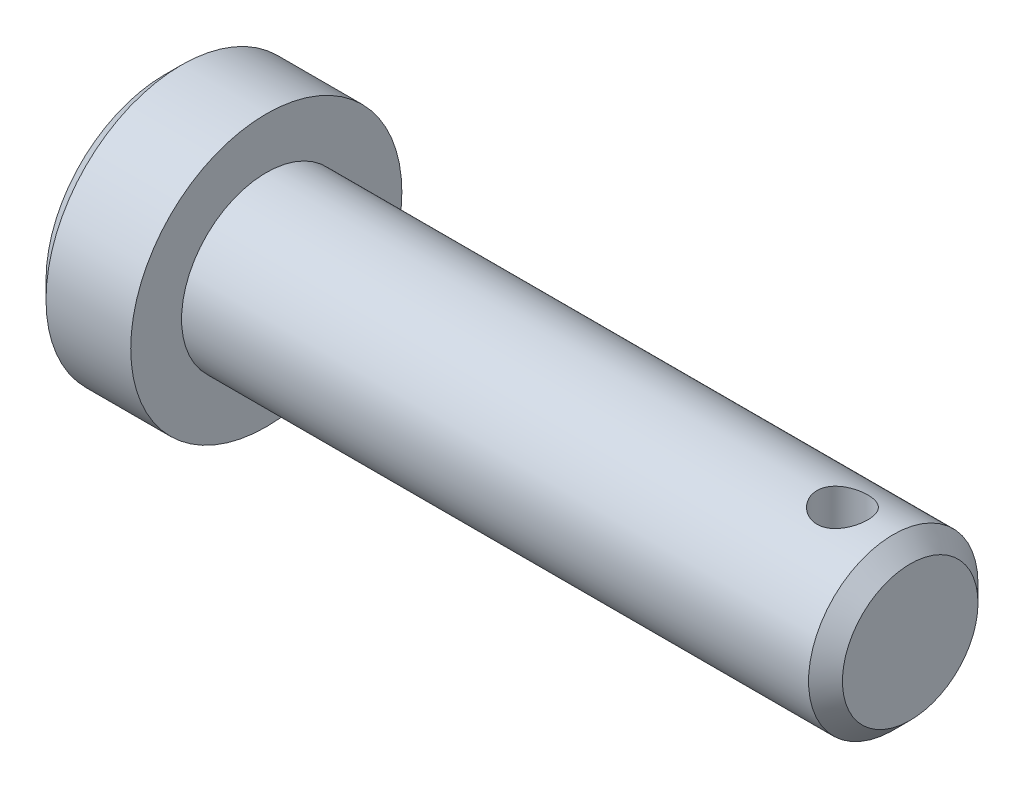
ISO-10303-21;
HEADER;
FILE_DESCRIPTION(('STEP AP214'),'2;1');
FILE_NAME('part.step','',(''),(''),'','','');
FILE_SCHEMA(('AUTOMOTIVE_DESIGN { 1 0 10303 214 1 1 1 1 }'));
ENDSEC;
DATA;
#1=APPLICATION_CONTEXT('core data for automotive mechanical design processes');
#2=APPLICATION_PROTOCOL_DEFINITION('international standard','automotive_design',2000,#1);
#3=PRODUCT_CONTEXT('',#1,'mechanical');
#4=PRODUCT('Part','Part','',(#3));
#5=PRODUCT_RELATED_PRODUCT_CATEGORY('part','',(#4));
#6=PRODUCT_DEFINITION_FORMATION('','',#4);
#7=PRODUCT_DEFINITION_CONTEXT('part definition',#1,'design');
#8=PRODUCT_DEFINITION('design','',#6,#7);
#9=PRODUCT_DEFINITION_SHAPE('','',#8);
#10=(LENGTH_UNIT() NAMED_UNIT(*) SI_UNIT(.MILLI.,.METRE.));
#11=(NAMED_UNIT(*) PLANE_ANGLE_UNIT() SI_UNIT($,.RADIAN.));
#12=(NAMED_UNIT(*) SI_UNIT($,.STERADIAN.) SOLID_ANGLE_UNIT());
#13=UNCERTAINTY_MEASURE_WITH_UNIT(LENGTH_MEASURE(1.E-05),#10,'distance_accuracy_value','');
#14=(GEOMETRIC_REPRESENTATION_CONTEXT(3) GLOBAL_UNCERTAINTY_ASSIGNED_CONTEXT((#13)) GLOBAL_UNIT_ASSIGNED_CONTEXT((#10,
#11,#12)) REPRESENTATION_CONTEXT('',''));
#15=CARTESIAN_POINT('',(0.,0.,0.));
#16=DIRECTION('',(0.,0.,1.));
#17=DIRECTION('',(1.,0.,0.));
#18=AXIS2_PLACEMENT_3D('',#15,#16,#17);
#19=CARTESIAN_POINT('',(-26.2666666666667,0.,0.));
#20=DIRECTION('',(-1.,0.,0.));
#21=DIRECTION('',(0.,0.,1.));
#22=AXIS2_PLACEMENT_3D('',#19,#20,#21);
#23=PLANE('',#22);
#24=CARTESIAN_POINT('',(-26.2666666666667,0.,0.));
#25=DIRECTION('',(-1.,0.,0.));
#26=DIRECTION('',(0.,0.,1.));
#27=AXIS2_PLACEMENT_3D('',#24,#25,#26);
#28=CIRCLE('',#27,6.99999999999999);
#29=CARTESIAN_POINT('',(-26.2666666666667,0.,6.99999999999999));
#30=VERTEX_POINT('',#29);
#31=EDGE_CURVE('E10',#30,#30,#28,.T.);
#32=ORIENTED_EDGE('',*,*,#31,.T.);
#33=EDGE_LOOP('',(#32));
#34=FACE_BOUND('',#33,.T.);
#35=ADVANCED_FACE('F36',(#34),#23,.T.);
#36=CARTESIAN_POINT('',(0.,0.,0.));
#37=DIRECTION('',(1.,0.,0.));
#38=DIRECTION('',(0.,0.,-1.));
#39=AXIS2_PLACEMENT_3D('',#36,#37,#38);
#40=CYLINDRICAL_SURFACE('',#39,8.);
#41=CARTESIAN_POINT('',(-25.2666666666667,0.,0.));
#42=DIRECTION('',(-1.,0.,0.));
#43=DIRECTION('',(0.,0.,1.));
#44=AXIS2_PLACEMENT_3D('',#41,#42,#43);
#45=CIRCLE('',#44,8.);
#46=CARTESIAN_POINT('',(-25.2666666666667,0.,8.));
#47=VERTEX_POINT('',#46);
#48=EDGE_CURVE('E49',#47,#47,#45,.F.);
#49=ORIENTED_EDGE('',*,*,#48,.T.);
#50=EDGE_LOOP('',(#49));
#51=FACE_BOUND('',#50,.T.);
#52=CARTESIAN_POINT('',(-20.2666666666667,0.,0.));
#53=DIRECTION('',(1.,0.,0.));
#54=DIRECTION('',(0.,0.,-1.));
#55=AXIS2_PLACEMENT_3D('',#52,#53,#54);
#56=CIRCLE('',#55,8.);
#57=CARTESIAN_POINT('',(-20.2666666666667,0.,-8.));
#58=VERTEX_POINT('',#57);
#59=EDGE_CURVE('E98',#58,#58,#56,.T.);
#60=ORIENTED_EDGE('',*,*,#59,.F.);
#61=EDGE_LOOP('',(#60));
#62=FACE_BOUND('',#61,.T.);
#63=ADVANCED_FACE('F84',(#51,#62),#40,.T.);
#64=CARTESIAN_POINT('',(-20.2666666666667,8.,0.));
#65=DIRECTION('',(1.,0.,0.));
#66=DIRECTION('',(0.,0.,-1.));
#67=AXIS2_PLACEMENT_3D('',#64,#65,#66);
#68=PLANE('',#67);
#69=ORIENTED_EDGE('',*,*,#59,.T.);
#70=EDGE_LOOP('',(#69));
#71=FACE_BOUND('',#70,.T.);
#72=CARTESIAN_POINT('',(-20.2666666666667,0.,0.));
#73=DIRECTION('',(1.,0.,0.));
#74=DIRECTION('',(0.,0.,-1.));
#75=AXIS2_PLACEMENT_3D('',#72,#73,#74);
#76=CIRCLE('',#75,5.);
#77=CARTESIAN_POINT('',(-20.2666666666667,0.,-5.));
#78=VERTEX_POINT('',#77);
#79=EDGE_CURVE('E101',#78,#78,#76,.T.);
#80=ORIENTED_EDGE('',*,*,#79,.F.);
#81=EDGE_LOOP('',(#80));
#82=FACE_BOUND('',#81,.T.);
#83=ADVANCED_FACE('F80',(#71,#82),#68,.T.);
#84=CARTESIAN_POINT('',(0.,0.,0.));
#85=DIRECTION('',(1.,0.,0.));
#86=DIRECTION('',(0.,0.,-1.));
#87=AXIS2_PLACEMENT_3D('',#84,#85,#86);
#88=CYLINDRICAL_SURFACE('',#87,5.);
#89=CARTESIAN_POINT('',(13.7333333333333,-4.76969600708473,1.5));
#90=CARTESIAN_POINT('',(13.6511387853909,-4.7696968572698,1.49999897633764));
#91=CARTESIAN_POINT('',(13.5689341091893,-4.77184390209068,1.49322108167142));
#92=CARTESIAN_POINT('',(13.4069280837414,-4.780165783029,1.46635844446749));
#93=CARTESIAN_POINT('',(13.3271275468318,-4.78634196493468,1.44626925573578));
#94=CARTESIAN_POINT('',(13.1722986050616,-4.80196102485632,1.39352753269955));
#95=CARTESIAN_POINT('',(13.0972625037002,-4.81139846703232,1.36089589394243));
#96=CARTESIAN_POINT('',(12.953711399338,-4.83246932547567,1.28406421917929));
#97=CARTESIAN_POINT('',(12.8851973746489,-4.84410307041019,1.23986245137053));
#98=CARTESIAN_POINT('',(12.7544669427559,-4.86866862185765,1.13964754141627));
#99=CARTESIAN_POINT('',(12.692487435387,-4.88162808311635,1.08333207175807));
#100=CARTESIAN_POINT('',(12.5786953820108,-4.90714861936757,0.961136237579597));
#101=CARTESIAN_POINT('',(12.5268841428834,-4.91970964297705,0.89525464546111));
#102=CARTESIAN_POINT('',(12.4338706335,-4.94333214579389,0.754111437793689));
#103=CARTESIAN_POINT('',(12.3929099088905,-4.95435724342404,0.678684021335814));
#104=CARTESIAN_POINT('',(12.3243460742905,-4.97334435920684,0.521624645369353));
#105=CARTESIAN_POINT('',(12.2967400834758,-4.98130703789495,0.439994028387911));
#106=CARTESIAN_POINT('',(12.2564533322428,-4.99307646003589,0.275323852630829));
#107=CARTESIAN_POINT('',(12.2433682056806,-4.99699557369338,0.1923913989538));
#108=CARTESIAN_POINT('',(12.2312160086869,-5.00063201501347,0.025421823749314));
#109=CARTESIAN_POINT('',(12.2321459939313,-5.00035022521079,-0.0586150620503692));
#110=CARTESIAN_POINT('',(12.2477262018763,-4.99569603817658,-0.222571156600161));
#111=CARTESIAN_POINT('',(12.2619385271432,-4.9914542020526,-0.302536267641342));
#112=CARTESIAN_POINT('',(12.3029646693276,-4.97951522112593,-0.458889213442528));
#113=CARTESIAN_POINT('',(12.329779284276,-4.97181785750586,-0.535276821322847));
#114=CARTESIAN_POINT('',(12.3955453567519,-4.95365220986963,-0.683347326351282));
#115=CARTESIAN_POINT('',(12.4346345361406,-4.94315269676706,-0.754965064694479));
#116=CARTESIAN_POINT('',(12.5237311857615,-4.92049640648069,-0.890764673783157));
#117=CARTESIAN_POINT('',(12.5737412462968,-4.90833923637778,-0.954944774872132));
#118=CARTESIAN_POINT('',(12.6855310840849,-4.88311550488165,-1.0766604815298));
#119=CARTESIAN_POINT('',(12.747690252363,-4.87003195321461,-1.13384458040112));
#120=CARTESIAN_POINT('',(12.8808433512233,-4.84483979887497,-1.23707651539824));
#121=CARTESIAN_POINT('',(12.9518381587225,-4.8327312931702,-1.28312324482853));
#122=CARTESIAN_POINT('',(13.1015728025823,-4.81077903197677,-1.3631399533545));
#123=CARTESIAN_POINT('',(13.1803803791962,-4.80095810695956,-1.3969898923768));
#124=CARTESIAN_POINT('',(13.3429405417788,-4.78496392548436,-1.45083362878413));
#125=CARTESIAN_POINT('',(13.4266915048679,-4.77878947915829,-1.4708319464056));
#126=CARTESIAN_POINT('',(13.5934156940726,-4.77104849541241,-1.49574770282165));
#127=CARTESIAN_POINT('',(13.6763015572273,-4.7693187867044,-1.50119946380212));
#128=CARTESIAN_POINT('',(13.8418062333432,-4.77021192441924,-1.49835947233062));
#129=CARTESIAN_POINT('',(13.9244250820641,-4.77283416156589,-1.4900696437133));
#130=CARTESIAN_POINT('',(14.0848217113042,-4.78197558554912,-1.4604576357419));
#131=CARTESIAN_POINT('',(14.1626694975968,-4.78839176507488,-1.4394796143128));
#132=CARTESIAN_POINT('',(14.3137350241482,-4.80429141231227,-1.3854857774794));
#133=CARTESIAN_POINT('',(14.3869520474739,-4.81377535359073,-1.3524681034276));
#134=CARTESIAN_POINT('',(14.5288507974054,-4.83505835023047,-1.274318711965));
#135=CARTESIAN_POINT('',(14.5973580543191,-4.84691271069798,-1.22888564172729));
#136=CARTESIAN_POINT('',(14.7259714395141,-4.87148205646987,-1.12755301600385));
#137=CARTESIAN_POINT('',(14.7860755509461,-4.88419724730003,-1.07165095534896));
#138=CARTESIAN_POINT('',(14.898513739148,-4.90963633548158,-0.948455132493598));
#139=CARTESIAN_POINT('',(14.9504689623203,-4.92234245063004,-0.880811065857433));
#140=CARTESIAN_POINT('',(15.042300034361,-4.9458485174865,-0.737461784590248));
#141=CARTESIAN_POINT('',(15.0821764831148,-4.95664856384717,-0.661756970543943));
#142=CARTESIAN_POINT('',(15.1483333639016,-4.97505970474957,-0.504935504705221));
#143=CARTESIAN_POINT('',(15.1747153494923,-4.98269453424965,-0.423864622037838));
#144=CARTESIAN_POINT('',(15.2133942522237,-4.99401979596827,-0.258169966504586));
#145=CARTESIAN_POINT('',(15.2256951992817,-4.9977113567088,-0.173547217354761));
#146=CARTESIAN_POINT('',(15.2355563773878,-5.00066544081399,-0.00665215388274139));
#147=CARTESIAN_POINT('',(15.2336660287411,-5.00009305111322,0.0755851790862079));
#148=CARTESIAN_POINT('',(15.2165117008342,-4.99497264465036,0.238519481164405));
#149=CARTESIAN_POINT('',(15.2012484798529,-4.99042485330462,0.31921653734653));
#150=CARTESIAN_POINT('',(15.1581216719337,-4.97791168358326,0.47593581304136));
#151=CARTESIAN_POINT('',(15.1303951526843,-4.96998352900865,0.551998927351394));
#152=CARTESIAN_POINT('',(15.0632514188261,-4.9515294303945,0.698433237752055));
#153=CARTESIAN_POINT('',(15.0238322830471,-4.94100305949946,0.768803496050581));
#154=CARTESIAN_POINT('',(14.9329598759033,-4.91803965828228,0.904301892420565));
#155=CARTESIAN_POINT('',(14.8811619033325,-4.90555226923559,0.969190250076769));
#156=CARTESIAN_POINT('',(14.7676229450005,-4.88023537212334,1.08953757134595));
#157=CARTESIAN_POINT('',(14.7058790954351,-4.86740576641079,1.14499380960194));
#158=CARTESIAN_POINT('',(14.5719925550228,-4.84240680631319,1.24656269394549));
#159=CARTESIAN_POINT('',(14.4995947799429,-4.83026852693485,1.29234759757956));
#160=CARTESIAN_POINT('',(14.3477781591723,-4.80852547508793,1.37104313528776));
#161=CARTESIAN_POINT('',(14.2683627097321,-4.79891948596955,1.40395995557289));
#162=CARTESIAN_POINT('',(14.113592901727,-4.78427816717594,1.4530194253295));
#163=CARTESIAN_POINT('',(14.0387246864023,-4.7788615484052,1.47058859011232));
#164=CARTESIAN_POINT('',(13.8870181108375,-4.77157042597166,1.49407818835144));
#165=CARTESIAN_POINT('',(13.810180148688,-4.7696952122143,1.50000095706095));
#166=CARTESIAN_POINT('',(13.7333333333333,-4.76969600708473,1.5));
#167=B_SPLINE_CURVE_WITH_KNOTS('',3,(#89,#90,#91,#92,#93,#94,#95,#96,#97,#98,#99,#100,#101,#102,
#103,#104,#105,#106,#107,#108,#109,#110,#111,#112,#113,#114,#115,#116,#117,#118,#119,#120,#121,
#122,#123,#124,#125,#126,#127,#128,#129,#130,#131,#132,#133,#134,#135,#136,#137,#138,#139,#140,
#141,#142,#143,#144,#145,#146,#147,#148,#149,#150,#151,#152,#153,#154,#155,#156,#157,#158,#159,
#160,#161,#162,#163,#164,#165,#166),.UNSPECIFIED.,.T.,.F.,(4,2,2,2,2,2,2,2,2,2,2,2,2,2,2,2,2,2,
2,2,2,2,2,2,2,2,2,2,2,2,2,2,2,2,2,2,2,2,4),(0.,0.246300165915542,0.492682641689001,
0.738656414466193,0.984667025370102,1.23773150007984,1.49082847871273,1.74915939273645,
2.00743455587877,2.25832140149558,2.5091555410144,2.7520012599088,2.99486235890376,
3.24055209335676,3.48630016590831,3.74152147023278,3.99676812491863,4.25446238246266,
4.51207250628411,4.76008080790309,5.00805439107388,5.24958594938817,5.49115481045787,
5.73920731809389,5.98731925928923,6.24479506100602,6.50225807324202,6.75775391814325,
7.01317662321682,7.2587630391122,7.50433553047755,7.74727096872219,7.99024634491378,
8.24099627054489,8.4918185262989,8.75011639669147,9.00828993963944,9.23861153857448,
9.4688869503356),.UNSPECIFIED.);
#168=CARTESIAN_POINT('',(13.7333333333333,-4.76969600708473,1.5));
#169=VERTEX_POINT('',#168);
#170=EDGE_CURVE('E40',#169,#169,#167,.T.);
#171=ORIENTED_EDGE('',*,*,#170,.F.);
#172=EDGE_LOOP('',(#171));
#173=FACE_BOUND('',#172,.T.);
#174=CARTESIAN_POINT('',(13.7333333333333,4.76969600708473,1.5));
#175=CARTESIAN_POINT('',(13.8155278812757,4.7696968572698,1.49999897633764));
#176=CARTESIAN_POINT('',(13.8977325574773,4.77184390209068,1.49322108167142));
#177=CARTESIAN_POINT('',(14.0597385829252,4.780165783029,1.46635844446749));
#178=CARTESIAN_POINT('',(14.1395391198348,4.78634196493468,1.44626925573578));
#179=CARTESIAN_POINT('',(14.294368061605,4.80196102485632,1.39352753269955));
#180=CARTESIAN_POINT('',(14.3694041629664,4.81139846703232,1.36089589394243));
#181=CARTESIAN_POINT('',(14.5129552673286,4.83246932547567,1.28406421917929));
#182=CARTESIAN_POINT('',(14.5814692920177,4.84410307041019,1.23986245137053));
#183=CARTESIAN_POINT('',(14.7121997239107,4.86866862185765,1.13964754141627));
#184=CARTESIAN_POINT('',(14.7741792312796,4.88162808311635,1.08333207175807));
#185=CARTESIAN_POINT('',(14.8879712846558,4.90714861936757,0.961136237579597));
#186=CARTESIAN_POINT('',(14.9397825237832,4.91970964297705,0.89525464546111));
#187=CARTESIAN_POINT('',(15.0327960331666,4.94333214579389,0.754111437793689));
#188=CARTESIAN_POINT('',(15.0737567577761,4.95435724342404,0.678684021335814));
#189=CARTESIAN_POINT('',(15.1423205923761,4.97334435920684,0.521624645369353));
#190=CARTESIAN_POINT('',(15.1699265831907,4.98130703789495,0.439994028387911));
#191=CARTESIAN_POINT('',(15.2102133344238,4.99307646003589,0.275323852630829));
#192=CARTESIAN_POINT('',(15.223298460986,4.99699557369338,0.1923913989538));
#193=CARTESIAN_POINT('',(15.2354506579797,5.00063201501347,0.025421823749314));
#194=CARTESIAN_POINT('',(15.2345206727353,5.00035022521079,-0.0586150620503692));
#195=CARTESIAN_POINT('',(15.2189404647903,4.99569603817658,-0.222571156600161));
#196=CARTESIAN_POINT('',(15.2047281395234,4.9914542020526,-0.302536267641342));
#197=CARTESIAN_POINT('',(15.163701997339,4.97951522112593,-0.458889213442528));
#198=CARTESIAN_POINT('',(15.1368873823906,4.97181785750586,-0.535276821322847));
#199=CARTESIAN_POINT('',(15.0711213099147,4.95365220986963,-0.683347326351282));
#200=CARTESIAN_POINT('',(15.032032130526,4.94315269676706,-0.754965064694479));
#201=CARTESIAN_POINT('',(14.9429354809051,4.92049640648069,-0.890764673783157));
#202=CARTESIAN_POINT('',(14.8929254203698,4.90833923637778,-0.954944774872132));
#203=CARTESIAN_POINT('',(14.7811355825817,4.88311550488165,-1.0766604815298));
#204=CARTESIAN_POINT('',(14.7189764143036,4.87003195321461,-1.13384458040112));
#205=CARTESIAN_POINT('',(14.5858233154432,4.84483979887497,-1.23707651539824));
#206=CARTESIAN_POINT('',(14.5148285079441,4.8327312931702,-1.28312324482853));
#207=CARTESIAN_POINT('',(14.3650938640843,4.81077903197677,-1.3631399533545));
#208=CARTESIAN_POINT('',(14.2862862874704,4.80095810695956,-1.3969898923768));
#209=CARTESIAN_POINT('',(14.1237261248877,4.78496392548436,-1.45083362878413));
#210=CARTESIAN_POINT('',(14.0399751617987,4.77878947915829,-1.4708319464056));
#211=CARTESIAN_POINT('',(13.873250972594,4.77104849541241,-1.49574770282165));
#212=CARTESIAN_POINT('',(13.7903651094393,4.7693187867044,-1.50119946380212));
#213=CARTESIAN_POINT('',(13.6248604333234,4.77021192441924,-1.49835947233062));
#214=CARTESIAN_POINT('',(13.5422415846024,4.77283416156589,-1.4900696437133));
#215=CARTESIAN_POINT('',(13.3818449553624,4.78197558554912,-1.4604576357419));
#216=CARTESIAN_POINT('',(13.3039971690698,4.78839176507488,-1.4394796143128));
#217=CARTESIAN_POINT('',(13.1529316425184,4.80429141231227,-1.3854857774794));
#218=CARTESIAN_POINT('',(13.0797146191927,4.81377535359073,-1.3524681034276));
#219=CARTESIAN_POINT('',(12.9378158692612,4.83505835023047,-1.274318711965));
#220=CARTESIAN_POINT('',(12.8693086123475,4.84691271069798,-1.22888564172729));
#221=CARTESIAN_POINT('',(12.7406952271525,4.87148205646987,-1.12755301600385));
#222=CARTESIAN_POINT('',(12.6805911157205,4.88419724730003,-1.07165095534896));
#223=CARTESIAN_POINT('',(12.5681529275186,4.90963633548158,-0.948455132493598));
#224=CARTESIAN_POINT('',(12.5161977043463,4.92234245063004,-0.880811065857434));
#225=CARTESIAN_POINT('',(12.4243666323055,4.9458485174865,-0.737461784590249));
#226=CARTESIAN_POINT('',(12.3844901835518,4.95664856384717,-0.661756970543943));
#227=CARTESIAN_POINT('',(12.318333302765,4.97505970474957,-0.504935504705221));
#228=CARTESIAN_POINT('',(12.2919513171743,4.98269453424965,-0.423864622037838));
#229=CARTESIAN_POINT('',(12.2532724144429,4.99401979596827,-0.258169966504586));
#230=CARTESIAN_POINT('',(12.2409714673849,4.9977113567088,-0.173547217354761));
#231=CARTESIAN_POINT('',(12.2311102892788,5.00066544081399,-0.00665215388274139));
#232=CARTESIAN_POINT('',(12.2330006379255,5.00009305111322,0.0755851790862079));
#233=CARTESIAN_POINT('',(12.2501549658324,4.99497264465036,0.238519481164405));
#234=CARTESIAN_POINT('',(12.2654181868137,4.99042485330462,0.31921653734653));
#235=CARTESIAN_POINT('',(12.3085449947329,4.97791168358326,0.47593581304136));
#236=CARTESIAN_POINT('',(12.3362715139823,4.96998352900865,0.551998927351394));
#237=CARTESIAN_POINT('',(12.4034152478405,4.9515294303945,0.698433237752055));
#238=CARTESIAN_POINT('',(12.4428343836195,4.94100305949946,0.768803496050581));
#239=CARTESIAN_POINT('',(12.5337067907633,4.91803965828228,0.904301892420565));
#240=CARTESIAN_POINT('',(12.5855047633341,4.90555226923559,0.969190250076769));
#241=CARTESIAN_POINT('',(12.6990437216661,4.88023537212334,1.08953757134595));
#242=CARTESIAN_POINT('',(12.7607875712314,4.86740576641079,1.14499380960194));
#243=CARTESIAN_POINT('',(12.8946741116438,4.84240680631319,1.24656269394549));
#244=CARTESIAN_POINT('',(12.9670718867237,4.83026852693485,1.29234759757956));
#245=CARTESIAN_POINT('',(13.1188885074943,4.80852547508793,1.37104313528776));
#246=CARTESIAN_POINT('',(13.1983039569345,4.79891948596955,1.40395995557289));
#247=CARTESIAN_POINT('',(13.3530737649396,4.78427816717594,1.4530194253295));
#248=CARTESIAN_POINT('',(13.4279419802643,4.7788615484052,1.47058859011232));
#249=CARTESIAN_POINT('',(13.5796485558291,4.77157042597166,1.49407818835144));
#250=CARTESIAN_POINT('',(13.6564865179785,4.7696952122143,1.50000095706095));
#251=CARTESIAN_POINT('',(13.7333333333333,4.76969600708473,1.5));
#252=B_SPLINE_CURVE_WITH_KNOTS('',3,(#174,#175,#176,#177,#178,#179,#180,#181,#182,#183,#184,
#185,#186,#187,#188,#189,#190,#191,#192,#193,#194,#195,#196,#197,#198,#199,#200,#201,#202,#203,
#204,#205,#206,#207,#208,#209,#210,#211,#212,#213,#214,#215,#216,#217,#218,#219,#220,#221,#222,
#223,#224,#225,#226,#227,#228,#229,#230,#231,#232,#233,#234,#235,#236,#237,#238,#239,#240,#241,
#242,#243,#244,#245,#246,#247,#248,#249,#250,#251),.UNSPECIFIED.,.T.,.F.,(4,2,2,2,2,2,2,2,2,2,2,
2,2,2,2,2,2,2,2,2,2,2,2,2,2,2,2,2,2,2,2,2,2,2,2,2,2,2,4),(0.,0.246300165915542,
0.492682641689001,0.738656414466195,0.984667025370102,1.23773150007984,1.49082847871273,
1.74915939273645,2.00743455587877,2.25832140149558,2.5091555410144,2.7520012599088,
2.99486235890376,3.24055209335676,3.48630016590831,3.74152147023278,3.99676812491863,
4.25446238246267,4.51207250628411,4.7600808079031,5.00805439107388,5.24958594938817,
5.49115481045787,5.73920731809389,5.98731925928923,6.24479506100602,6.50225807324202,
6.75775391814325,7.01317662321682,7.2587630391122,7.50433553047755,7.74727096872219,
7.99024634491379,8.24099627054489,8.49181852629891,8.75011639669147,9.00828993963944,
9.23861153857448,9.46888695033561),.UNSPECIFIED.);
#253=CARTESIAN_POINT('',(13.7333333333333,4.76969600708473,1.5));
#254=VERTEX_POINT('',#253);
#255=EDGE_CURVE('E57',#254,#254,#252,.T.);
#256=ORIENTED_EDGE('',*,*,#255,.F.);
#257=EDGE_LOOP('',(#256));
#258=FACE_BOUND('',#257,.T.);
#259=CARTESIAN_POINT('',(16.7333333333333,0.,0.));
#260=DIRECTION('',(1.,0.,0.));
#261=DIRECTION('',(0.,0.,-1.));
#262=AXIS2_PLACEMENT_3D('',#259,#260,#261);
#263=CIRCLE('',#262,5.);
#264=CARTESIAN_POINT('',(16.7333333333333,0.,-5.));
#265=VERTEX_POINT('',#264);
#266=EDGE_CURVE('E54',#265,#265,#263,.F.);
#267=ORIENTED_EDGE('',*,*,#266,.T.);
#268=EDGE_LOOP('',(#267));
#269=FACE_BOUND('',#268,.T.);
#270=ORIENTED_EDGE('',*,*,#79,.T.);
#271=EDGE_LOOP('',(#270));
#272=FACE_BOUND('',#271,.T.);
#273=ADVANCED_FACE('F62',(#173,#258,#269,#272),#88,.T.);
#274=CARTESIAN_POINT('',(17.7333333333333,5.,0.));
#275=DIRECTION('',(1.,0.,0.));
#276=DIRECTION('',(0.,0.,-1.));
#277=AXIS2_PLACEMENT_3D('',#274,#275,#276);
#278=PLANE('',#277);
#279=CARTESIAN_POINT('',(17.7333333333333,0.,0.));
#280=DIRECTION('',(1.,0.,0.));
#281=DIRECTION('',(0.,0.,-1.));
#282=AXIS2_PLACEMENT_3D('',#279,#280,#281);
#283=CIRCLE('',#282,3.99999999999999);
#284=CARTESIAN_POINT('',(17.7333333333333,0.,-3.99999999999999));
#285=VERTEX_POINT('',#284);
#286=EDGE_CURVE('E104',#285,#285,#283,.T.);
#287=ORIENTED_EDGE('',*,*,#286,.T.);
#288=EDGE_LOOP('',(#287));
#289=FACE_BOUND('',#288,.T.);
#290=ADVANCED_FACE('F70',(#289),#278,.T.);
#291=CARTESIAN_POINT('',(17.7333333333333,0.,0.));
#292=DIRECTION('',(-1.,0.,0.));
#293=DIRECTION('',(0.,0.,1.));
#294=AXIS2_PLACEMENT_3D('',#291,#292,#293);
#295=CONICAL_SURFACE('',#294,3.99999999999999,0.785398163397443);
#296=ORIENTED_EDGE('',*,*,#266,.F.);
#297=EDGE_LOOP('',(#296));
#298=FACE_BOUND('',#297,.T.);
#299=ORIENTED_EDGE('',*,*,#286,.F.);
#300=EDGE_LOOP('',(#299));
#301=FACE_BOUND('',#300,.T.);
#302=ADVANCED_FACE('F73',(#298,#301),#295,.T.);
#303=CARTESIAN_POINT('',(-25.2666666666667,0.,0.));
#304=DIRECTION('',(1.,0.,0.));
#305=DIRECTION('',(0.,0.,-1.));
#306=AXIS2_PLACEMENT_3D('',#303,#304,#305);
#307=CONICAL_SURFACE('',#306,8.,0.785398163397452);
#308=ORIENTED_EDGE('',*,*,#31,.F.);
#309=EDGE_LOOP('',(#308));
#310=FACE_BOUND('',#309,.T.);
#311=ORIENTED_EDGE('',*,*,#48,.F.);
#312=EDGE_LOOP('',(#311));
#313=FACE_BOUND('',#312,.T.);
#314=ADVANCED_FACE('F38',(#310,#313),#307,.T.);
#315=CARTESIAN_POINT('',(13.7333333333333,-8.,0.));
#316=DIRECTION('',(0.,1.,0.));
#317=DIRECTION('',(0.,0.,1.));
#318=AXIS2_PLACEMENT_3D('',#315,#316,#317);
#319=CYLINDRICAL_SURFACE('',#318,1.5);
#320=ORIENTED_EDGE('',*,*,#170,.T.);
#321=EDGE_LOOP('',(#320));
#322=FACE_BOUND('',#321,.T.);
#323=ORIENTED_EDGE('',*,*,#255,.T.);
#324=EDGE_LOOP('',(#323));
#325=FACE_BOUND('',#324,.T.);
#326=ADVANCED_FACE('F66',(#322,#325),#319,.F.);
#327=CLOSED_SHELL('',(#35,#63,#83,#273,#290,#302,#314,#326));
#328=MANIFOLD_SOLID_BREP('B2',#327);
#329=ADVANCED_BREP_SHAPE_REPRESENTATION('',(#18,#328),#14);
#330=SHAPE_DEFINITION_REPRESENTATION(#9,#329);
ENDSEC;
END-ISO-10303-21;
